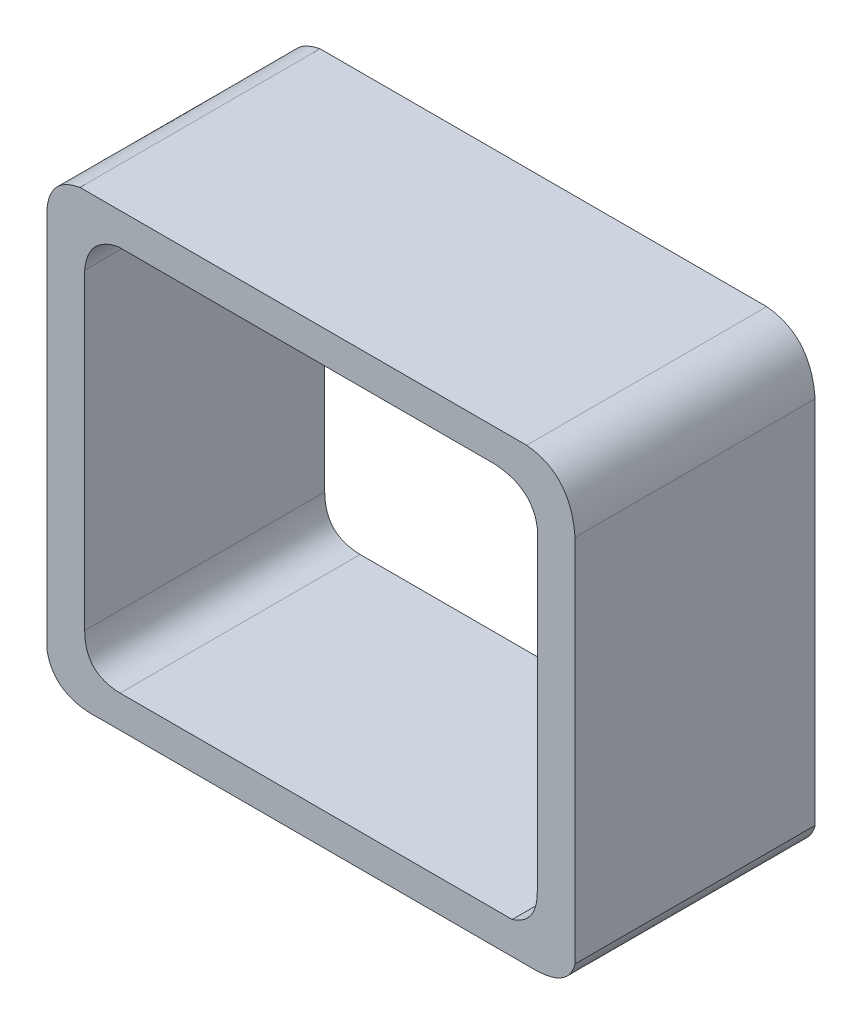
ISO-10303-21;
HEADER;
FILE_DESCRIPTION(('STEP AP214'),'2;1');
FILE_NAME('part.step','',(''),(''),'','','');
FILE_SCHEMA(('AUTOMOTIVE_DESIGN { 1 0 10303 214 1 1 1 1 }'));
ENDSEC;
DATA;
#1=APPLICATION_CONTEXT('core data for automotive mechanical design processes');
#2=APPLICATION_PROTOCOL_DEFINITION('international standard','automotive_design',2000,#1);
#3=PRODUCT_CONTEXT('',#1,'mechanical');
#4=PRODUCT('Part','Part','',(#3));
#5=PRODUCT_RELATED_PRODUCT_CATEGORY('part','',(#4));
#6=PRODUCT_DEFINITION_FORMATION('','',#4);
#7=PRODUCT_DEFINITION_CONTEXT('part definition',#1,'design');
#8=PRODUCT_DEFINITION('design','',#6,#7);
#9=PRODUCT_DEFINITION_SHAPE('','',#8);
#10=(LENGTH_UNIT() NAMED_UNIT(*) SI_UNIT(.MILLI.,.METRE.));
#11=(NAMED_UNIT(*) PLANE_ANGLE_UNIT() SI_UNIT($,.RADIAN.));
#12=(NAMED_UNIT(*) SI_UNIT($,.STERADIAN.) SOLID_ANGLE_UNIT());
#13=UNCERTAINTY_MEASURE_WITH_UNIT(LENGTH_MEASURE(1.E-05),#10,'distance_accuracy_value','');
#14=(GEOMETRIC_REPRESENTATION_CONTEXT(3) GLOBAL_UNCERTAINTY_ASSIGNED_CONTEXT((#13)) GLOBAL_UNIT_ASSIGNED_CONTEXT((#10,
#11,#12)) REPRESENTATION_CONTEXT('',''));
#15=CARTESIAN_POINT('',(0.,0.,0.));
#16=DIRECTION('',(0.,0.,1.));
#17=DIRECTION('',(1.,0.,0.));
#18=AXIS2_PLACEMENT_3D('',#15,#16,#17);
#19=CARTESIAN_POINT('',(16.6593102697515,13.9304612155311,16.));
#20=DIRECTION('',(0.,0.,1.));
#21=DIRECTION('',(1.,0.,0.));
#22=AXIS2_PLACEMENT_3D('',#19,#20,#21);
#23=PLANE('',#22);
#24=CARTESIAN_POINT('',(17.6042980663156,11.30338400737,16.));
#25=CARTESIAN_POINT('',(17.4217243030286,13.5739482873747,16.));
#26=CARTESIAN_POINT('',(16.3443143375626,14.8061536182515,16.));
#27=CARTESIAN_POINT('',(14.3720681699228,15.,16.));
#28=B_SPLINE_CURVE_WITH_KNOTS('',3,(#24,#25,#26,#27),.UNSPECIFIED.,.F.,.F.,(4,4),
(0.157316623204731,1.),.UNSPECIFIED.);
#29=CARTESIAN_POINT('',(17.6042980663156,11.30338400737,16.));
#30=VERTEX_POINT('',#29);
#31=CARTESIAN_POINT('',(14.3720681699228,15.,16.));
#32=VERTEX_POINT('',#31);
#33=EDGE_CURVE('E262',#30,#32,#28,.T.);
#34=ORIENTED_EDGE('',*,*,#33,.T.);
#35=DIRECTION('',(-1.,0.,0.));
#36=VECTOR('',#35,1.);
#37=CARTESIAN_POINT('',(-15.3949592837298,15.,16.));
#38=LINE('',#37,#36);
#39=CARTESIAN_POINT('',(-15.3949592837298,15.,16.));
#40=VERTEX_POINT('',#39);
#41=EDGE_CURVE('E322',#32,#40,#38,.T.);
#42=ORIENTED_EDGE('',*,*,#41,.T.);
#43=CARTESIAN_POINT('',(-15.3949592837298,15.,16.));
#44=CARTESIAN_POINT('',(-17.5420657981008,14.6102082271109,16.));
#45=CARTESIAN_POINT('',(-17.6042980663156,12.4074879216213,16.));
#46=B_SPLINE_CURVE_WITH_KNOTS('',2,(#43,#44,#45),.UNSPECIFIED.,.F.,.F.,(3,3),(0.,1.),.UNSPECIFIED.);
#47=CARTESIAN_POINT('',(-17.6042980663156,12.4074879216213,16.));
#48=VERTEX_POINT('',#47);
#49=EDGE_CURVE('E286',#40,#48,#46,.T.);
#50=ORIENTED_EDGE('',*,*,#49,.T.);
#51=DIRECTION('',(0.,-1.,0.));
#52=VECTOR('',#51,1.);
#53=CARTESIAN_POINT('',(-17.6042980663156,12.4074879216213,16.));
#54=LINE('',#53,#52);
#55=CARTESIAN_POINT('',(-17.6042980663156,-12.7760638343233,16.));
#56=VERTEX_POINT('',#55);
#57=EDGE_CURVE('E303',#48,#56,#54,.T.);
#58=ORIENTED_EDGE('',*,*,#57,.T.);
#59=CARTESIAN_POINT('',(-17.6042980663156,-12.7760638343233,16.));
#60=CARTESIAN_POINT('',(-17.2902562911604,-14.3902822267886,16.));
#61=CARTESIAN_POINT('',(-16.0853475526222,-15.1315942820107,16.));
#62=CARTESIAN_POINT('',(-13.9895718532953,-15.,16.));
#63=B_SPLINE_CURVE_WITH_KNOTS('',3,(#59,#60,#61,#62),.UNSPECIFIED.,.F.,.F.,(4,4),
(0.260635320462798,1.),.UNSPECIFIED.);
#64=CARTESIAN_POINT('',(-13.9895718532953,-15.,16.));
#65=VERTEX_POINT('',#64);
#66=EDGE_CURVE('E301',#56,#65,#63,.T.);
#67=ORIENTED_EDGE('',*,*,#66,.T.);
#68=DIRECTION('',(1.,0.,0.));
#69=VECTOR('',#68,1.);
#70=CARTESIAN_POINT('',(-13.9895718532953,-15.,16.));
#71=LINE('',#70,#69);
#72=CARTESIAN_POINT('',(15.0827152062505,-15.,16.));
#73=VERTEX_POINT('',#72);
#74=EDGE_CURVE('E219',#65,#73,#71,.T.);
#75=ORIENTED_EDGE('',*,*,#74,.T.);
#76=CARTESIAN_POINT('',(15.0827152062505,-15.,16.));
#77=CARTESIAN_POINT('',(16.4965680160882,-14.9362166063096,16.));
#78=CARTESIAN_POINT('',(17.3370956361099,-14.3775771990828,16.));
#79=CARTESIAN_POINT('',(17.6042980663156,-13.3240817783187,16.));
#80=B_SPLINE_CURVE_WITH_KNOTS('',3,(#76,#77,#78,#79),.UNSPECIFIED.,.F.,.F.,(4,4),
(0.317898453115513,1.),.UNSPECIFIED.);
#81=CARTESIAN_POINT('',(17.6042980663156,-13.3240817783187,16.));
#82=VERTEX_POINT('',#81);
#83=EDGE_CURVE('E212',#73,#82,#80,.T.);
#84=ORIENTED_EDGE('',*,*,#83,.T.);
#85=DIRECTION('',(0.,1.,0.));
#86=VECTOR('',#85,1.);
#87=CARTESIAN_POINT('',(17.6042980663156,11.30338400737,16.));
#88=LINE('',#87,#86);
#89=EDGE_CURVE('E218',#82,#30,#88,.T.);
#90=ORIENTED_EDGE('',*,*,#89,.T.);
#91=EDGE_LOOP('',(#34,#42,#50,#58,#67,#75,#84,#90));
#92=FACE_BOUND('',#91,.T.);
#93=DIRECTION('',(-1.,0.,0.));
#94=VECTOR('',#93,1.);
#95=CARTESIAN_POINT('',(-12.8689212726078,12.8514483929723,16.));
#96=LINE('',#95,#94);
#97=CARTESIAN_POINT('',(12.2903539527416,12.8514483929723,16.));
#98=VERTEX_POINT('',#97);
#99=CARTESIAN_POINT('',(-12.8689212726078,12.8514483929723,16.));
#100=VERTEX_POINT('',#99);
#101=EDGE_CURVE('E154',#98,#100,#96,.T.);
#102=ORIENTED_EDGE('',*,*,#101,.F.);
#103=CARTESIAN_POINT('',(15.082715212425,10.6131478156813,16.));
#104=CARTESIAN_POINT('',(14.8684502886742,11.9704653725608,16.));
#105=CARTESIAN_POINT('',(13.9376632021136,12.7165655649873,16.));
#106=CARTESIAN_POINT('',(12.2903539527416,12.8514483929723,16.));
#107=B_SPLINE_CURVE_WITH_KNOTS('',3,(#103,#104,#105,#106),.UNSPECIFIED.,.F.,.F.,(4,4),(0.,
0.76980243189382),.UNSPECIFIED.);
#108=CARTESIAN_POINT('',(15.082715212425,10.6131478156813,16.));
#109=VERTEX_POINT('',#108);
#110=EDGE_CURVE('E146',#109,#98,#107,.T.);
#111=ORIENTED_EDGE('',*,*,#110,.F.);
#112=DIRECTION('',(0.,1.,0.));
#113=VECTOR('',#112,1.);
#114=CARTESIAN_POINT('',(15.082715212425,10.6131478156813,16.));
#115=LINE('',#114,#113);
#116=CARTESIAN_POINT('',(15.082715212425,-10.4227582889799,16.));
#117=VERTEX_POINT('',#116);
#118=EDGE_CURVE('E345',#117,#109,#115,.T.);
#119=ORIENTED_EDGE('',*,*,#118,.F.);
#120=CARTESIAN_POINT('',(13.4154939988609,-12.8514483929723,16.));
#121=CARTESIAN_POINT('',(15.0812475900763,-12.3166377256463,16.));
#122=CARTESIAN_POINT('',(15.082715212425,-10.4227582889799,16.));
#123=B_SPLINE_CURVE_WITH_KNOTS('',2,(#120,#121,#122),.UNSPECIFIED.,.F.,.F.,(3,3),(0.,1.),.UNSPECIFIED.);
#124=CARTESIAN_POINT('',(13.4154939988609,-12.8514483929723,16.));
#125=VERTEX_POINT('',#124);
#126=EDGE_CURVE('E386',#125,#117,#123,.T.);
#127=ORIENTED_EDGE('',*,*,#126,.F.);
#128=DIRECTION('',(1.,0.,0.));
#129=VECTOR('',#128,1.);
#130=CARTESIAN_POINT('',(-12.7203453220306,-12.8514483929723,16.));
#131=LINE('',#130,#129);
#132=CARTESIAN_POINT('',(-12.7203453220306,-12.8514483929723,16.));
#133=VERTEX_POINT('',#132);
#134=EDGE_CURVE('E391',#133,#125,#131,.T.);
#135=ORIENTED_EDGE('',*,*,#134,.F.);
#136=CARTESIAN_POINT('',(-15.0827152062505,-10.4227582889799,16.));
#137=CARTESIAN_POINT('',(-15.0791376066579,-12.7991860372943,16.));
#138=CARTESIAN_POINT('',(-12.7203453220306,-12.8514483929723,16.));
#139=B_SPLINE_CURVE_WITH_KNOTS('',2,(#136,#137,#138),.UNSPECIFIED.,.F.,.F.,(3,3),(0.,1.),.UNSPECIFIED.);
#140=CARTESIAN_POINT('',(-15.0827152062505,-10.4227582889799,16.));
#141=VERTEX_POINT('',#140);
#142=EDGE_CURVE('E408',#141,#133,#139,.T.);
#143=ORIENTED_EDGE('',*,*,#142,.F.);
#144=DIRECTION('',(0.,-1.,0.));
#145=VECTOR('',#144,1.);
#146=CARTESIAN_POINT('',(-15.0827152062505,10.3750395219518,16.));
#147=LINE('',#146,#145);
#148=CARTESIAN_POINT('',(-15.0827152062505,10.3750395219518,16.));
#149=VERTEX_POINT('',#148);
#150=EDGE_CURVE('E169',#149,#141,#147,.T.);
#151=ORIENTED_EDGE('',*,*,#150,.F.);
#152=CARTESIAN_POINT('',(-12.8689212726078,12.8514483929723,16.));
#153=CARTESIAN_POINT('',(-14.9019133618119,12.4221796013516,16.));
#154=CARTESIAN_POINT('',(-15.0827152062505,10.3750395219518,16.));
#155=B_SPLINE_CURVE_WITH_KNOTS('',2,(#152,#153,#154),.UNSPECIFIED.,.F.,.F.,(3,3),(0.,1.),.UNSPECIFIED.);
#156=EDGE_CURVE('E167',#100,#149,#155,.T.);
#157=ORIENTED_EDGE('',*,*,#156,.F.);
#158=EDGE_LOOP('',(#102,#111,#119,#127,#135,#143,#151,#157));
#159=FACE_BOUND('',#158,.T.);
#160=ADVANCED_FACE('F32',(#92,#159),#23,.T.);
#161=CARTESIAN_POINT('',(16.6593102697515,13.9304612155311,0.));
#162=DIRECTION('',(0.,0.,1.));
#163=DIRECTION('',(1.,0.,0.));
#164=AXIS2_PLACEMENT_3D('',#161,#162,#163);
#165=PLANE('',#164);
#166=CARTESIAN_POINT('',(17.6042980663156,11.30338400737,0.));
#167=CARTESIAN_POINT('',(17.4217243030286,13.5739482873747,0.));
#168=CARTESIAN_POINT('',(16.3443143375626,14.8061536182515,0.));
#169=CARTESIAN_POINT('',(14.3720681699228,15.,0.));
#170=B_SPLINE_CURVE_WITH_KNOTS('',3,(#166,#167,#168,#169),.UNSPECIFIED.,.F.,.F.,(4,4),
(0.157316623204731,1.),.UNSPECIFIED.);
#171=CARTESIAN_POINT('',(17.6042980663156,11.30338400737,0.));
#172=VERTEX_POINT('',#171);
#173=CARTESIAN_POINT('',(14.3720681699228,15.,0.));
#174=VERTEX_POINT('',#173);
#175=EDGE_CURVE('E162',#172,#174,#170,.T.);
#176=ORIENTED_EDGE('',*,*,#175,.F.);
#177=DIRECTION('',(0.,1.,0.));
#178=VECTOR('',#177,1.);
#179=CARTESIAN_POINT('',(17.6042980663156,11.30338400737,0.));
#180=LINE('',#179,#178);
#181=CARTESIAN_POINT('',(17.6042980663156,-13.3240817783187,0.));
#182=VERTEX_POINT('',#181);
#183=EDGE_CURVE('E257',#182,#172,#180,.T.);
#184=ORIENTED_EDGE('',*,*,#183,.F.);
#185=CARTESIAN_POINT('',(15.0827152062505,-15.,0.));
#186=CARTESIAN_POINT('',(16.4965680160882,-14.9362166063096,0.));
#187=CARTESIAN_POINT('',(17.3370956361099,-14.3775771990828,0.));
#188=CARTESIAN_POINT('',(17.6042980663156,-13.3240817783187,0.));
#189=B_SPLINE_CURVE_WITH_KNOTS('',3,(#185,#186,#187,#188),.UNSPECIFIED.,.F.,.F.,(4,4),
(0.317898453115513,1.),.UNSPECIFIED.);
#190=CARTESIAN_POINT('',(15.0827152062505,-15.,0.));
#191=VERTEX_POINT('',#190);
#192=EDGE_CURVE('E253',#191,#182,#189,.T.);
#193=ORIENTED_EDGE('',*,*,#192,.F.);
#194=DIRECTION('',(1.,0.,0.));
#195=VECTOR('',#194,1.);
#196=CARTESIAN_POINT('',(-13.9895718532953,-15.,0.));
#197=LINE('',#196,#195);
#198=CARTESIAN_POINT('',(-13.9895718532953,-15.,0.));
#199=VERTEX_POINT('',#198);
#200=EDGE_CURVE('E248',#199,#191,#197,.T.);
#201=ORIENTED_EDGE('',*,*,#200,.F.);
#202=CARTESIAN_POINT('',(-17.6042980663156,-12.7760638343233,0.));
#203=CARTESIAN_POINT('',(-17.2902562911604,-14.3902822267886,0.));
#204=CARTESIAN_POINT('',(-16.0853475526222,-15.1315942820107,0.));
#205=CARTESIAN_POINT('',(-13.9895718532953,-15.,0.));
#206=B_SPLINE_CURVE_WITH_KNOTS('',3,(#202,#203,#204,#205),.UNSPECIFIED.,.F.,.F.,(4,4),
(0.260635320462798,1.),.UNSPECIFIED.);
#207=CARTESIAN_POINT('',(-17.6042980663156,-12.7760638343233,0.));
#208=VERTEX_POINT('',#207);
#209=EDGE_CURVE('E244',#208,#199,#206,.T.);
#210=ORIENTED_EDGE('',*,*,#209,.F.);
#211=DIRECTION('',(0.,-1.,0.));
#212=VECTOR('',#211,1.);
#213=CARTESIAN_POINT('',(-17.6042980663156,12.4074879216213,0.));
#214=LINE('',#213,#212);
#215=CARTESIAN_POINT('',(-17.6042980663156,12.4074879216213,0.));
#216=VERTEX_POINT('',#215);
#217=EDGE_CURVE('E239',#216,#208,#214,.T.);
#218=ORIENTED_EDGE('',*,*,#217,.F.);
#219=CARTESIAN_POINT('',(-15.3949592837298,15.,0.));
#220=CARTESIAN_POINT('',(-17.5420657981008,14.6102082271109,0.));
#221=CARTESIAN_POINT('',(-17.6042980663156,12.4074879216213,0.));
#222=B_SPLINE_CURVE_WITH_KNOTS('',2,(#219,#220,#221),.UNSPECIFIED.,.F.,.F.,(3,3),(0.,1.),.UNSPECIFIED.);
#223=CARTESIAN_POINT('',(-15.3949592837298,15.,0.));
#224=VERTEX_POINT('',#223);
#225=EDGE_CURVE('E235',#224,#216,#222,.T.);
#226=ORIENTED_EDGE('',*,*,#225,.F.);
#227=DIRECTION('',(-1.,0.,0.));
#228=VECTOR('',#227,1.);
#229=CARTESIAN_POINT('',(-15.3949592837298,15.,0.));
#230=LINE('',#229,#228);
#231=EDGE_CURVE('E230',#174,#224,#230,.T.);
#232=ORIENTED_EDGE('',*,*,#231,.F.);
#233=EDGE_LOOP('',(#176,#184,#193,#201,#210,#218,#226,#232));
#234=FACE_BOUND('',#233,.T.);
#235=CARTESIAN_POINT('',(15.082715212425,10.6131478156813,0.));
#236=CARTESIAN_POINT('',(14.8684502886742,11.9704653725608,0.));
#237=CARTESIAN_POINT('',(13.9376632021136,12.7165655649873,0.));
#238=CARTESIAN_POINT('',(12.2903539527416,12.8514483929723,0.));
#239=B_SPLINE_CURVE_WITH_KNOTS('',3,(#235,#236,#237,#238),.UNSPECIFIED.,.F.,.F.,(4,4),(0.,
0.76980243189382),.UNSPECIFIED.);
#240=CARTESIAN_POINT('',(15.082715212425,10.6131478156813,0.));
#241=VERTEX_POINT('',#240);
#242=CARTESIAN_POINT('',(12.2903539527416,12.8514483929723,0.));
#243=VERTEX_POINT('',#242);
#244=EDGE_CURVE('E56',#241,#243,#239,.T.);
#245=ORIENTED_EDGE('',*,*,#244,.T.);
#246=DIRECTION('',(-1.,0.,0.));
#247=VECTOR('',#246,1.);
#248=CARTESIAN_POINT('',(-12.8689212726078,12.8514483929723,0.));
#249=LINE('',#248,#247);
#250=CARTESIAN_POINT('',(-12.8689212726078,12.8514483929723,0.));
#251=VERTEX_POINT('',#250);
#252=EDGE_CURVE('E161',#243,#251,#249,.T.);
#253=ORIENTED_EDGE('',*,*,#252,.T.);
#254=CARTESIAN_POINT('',(-12.8689212726078,12.8514483929723,0.));
#255=CARTESIAN_POINT('',(-14.9019133618119,12.4221796013516,0.));
#256=CARTESIAN_POINT('',(-15.0827152062505,10.3750395219518,0.));
#257=B_SPLINE_CURVE_WITH_KNOTS('',2,(#254,#255,#256),.UNSPECIFIED.,.F.,.F.,(3,3),(0.,1.),.UNSPECIFIED.);
#258=CARTESIAN_POINT('',(-15.0827152062505,10.3750395219518,0.));
#259=VERTEX_POINT('',#258);
#260=EDGE_CURVE('E370',#251,#259,#257,.T.);
#261=ORIENTED_EDGE('',*,*,#260,.T.);
#262=DIRECTION('',(0.,-1.,0.));
#263=VECTOR('',#262,1.);
#264=CARTESIAN_POINT('',(-15.0827152062505,10.3750395219518,0.));
#265=LINE('',#264,#263);
#266=CARTESIAN_POINT('',(-15.0827152062505,-10.4227582889799,0.));
#267=VERTEX_POINT('',#266);
#268=EDGE_CURVE('E364',#259,#267,#265,.T.);
#269=ORIENTED_EDGE('',*,*,#268,.T.);
#270=CARTESIAN_POINT('',(-15.0827152062505,-10.4227582889799,0.));
#271=CARTESIAN_POINT('',(-15.0791376066579,-12.7991860372943,0.));
#272=CARTESIAN_POINT('',(-12.7203453220306,-12.8514483929723,0.));
#273=B_SPLINE_CURVE_WITH_KNOTS('',2,(#270,#271,#272),.UNSPECIFIED.,.F.,.F.,(3,3),(0.,1.),.UNSPECIFIED.);
#274=CARTESIAN_POINT('',(-12.7203453220306,-12.8514483929723,0.));
#275=VERTEX_POINT('',#274);
#276=EDGE_CURVE('E359',#267,#275,#273,.T.);
#277=ORIENTED_EDGE('',*,*,#276,.T.);
#278=DIRECTION('',(1.,0.,0.));
#279=VECTOR('',#278,1.);
#280=CARTESIAN_POINT('',(-12.7203453220306,-12.8514483929723,0.));
#281=LINE('',#280,#279);
#282=CARTESIAN_POINT('',(13.4154939988609,-12.8514483929723,0.));
#283=VERTEX_POINT('',#282);
#284=EDGE_CURVE('E353',#275,#283,#281,.T.);
#285=ORIENTED_EDGE('',*,*,#284,.T.);
#286=CARTESIAN_POINT('',(13.4154939988609,-12.8514483929723,0.));
#287=CARTESIAN_POINT('',(15.0812475900763,-12.3166377256463,0.));
#288=CARTESIAN_POINT('',(15.082715212425,-10.4227582889799,0.));
#289=B_SPLINE_CURVE_WITH_KNOTS('',2,(#286,#287,#288),.UNSPECIFIED.,.F.,.F.,(3,3),(0.,1.),.UNSPECIFIED.);
#290=CARTESIAN_POINT('',(15.082715212425,-10.4227582889799,0.));
#291=VERTEX_POINT('',#290);
#292=EDGE_CURVE('E348',#283,#291,#289,.T.);
#293=ORIENTED_EDGE('',*,*,#292,.T.);
#294=DIRECTION('',(0.,1.,0.));
#295=VECTOR('',#294,1.);
#296=CARTESIAN_POINT('',(15.082715212425,10.6131478156813,0.));
#297=LINE('',#296,#295);
#298=EDGE_CURVE('E155',#291,#241,#297,.T.);
#299=ORIENTED_EDGE('',*,*,#298,.T.);
#300=EDGE_LOOP('',(#245,#253,#261,#269,#277,#285,#293,#299));
#301=FACE_BOUND('',#300,.T.);
#302=ADVANCED_FACE('F197',(#234,#301),#165,.F.);
#303=DIRECTION('',(0.,0.,-1.));
#304=VECTOR('',#303,1.);
#305=SURFACE_OF_LINEAR_EXTRUSION('',#28,#304);
#306=ORIENTED_EDGE('',*,*,#175,.T.);
#307=DIRECTION('',(0.,0.,-1.));
#308=VECTOR('',#307,1.);
#309=CARTESIAN_POINT('',(14.3720681699228,15.,16.));
#310=LINE('',#309,#308);
#311=EDGE_CURVE('E11',#32,#174,#310,.T.);
#312=ORIENTED_EDGE('',*,*,#311,.F.);
#313=ORIENTED_EDGE('',*,*,#33,.F.);
#314=DIRECTION('',(0.,0.,-1.));
#315=VECTOR('',#314,1.);
#316=CARTESIAN_POINT('',(17.6042980663156,11.30338400737,16.));
#317=LINE('',#316,#315);
#318=EDGE_CURVE('E225',#30,#172,#317,.T.);
#319=ORIENTED_EDGE('',*,*,#318,.T.);
#320=EDGE_LOOP('',(#306,#312,#313,#319));
#321=FACE_BOUND('',#320,.T.);
#322=ADVANCED_FACE('F34',(#321),#305,.F.);
#323=CARTESIAN_POINT('',(-15.3949592837298,15.,16.));
#324=DIRECTION('',(0.,-1.,0.));
#325=DIRECTION('',(1.,0.,0.));
#326=AXIS2_PLACEMENT_3D('',#323,#324,#325);
#327=PLANE('',#326);
#328=ORIENTED_EDGE('',*,*,#231,.T.);
#329=DIRECTION('',(0.,0.,-1.));
#330=VECTOR('',#329,1.);
#331=CARTESIAN_POINT('',(-15.3949592837298,15.,16.));
#332=LINE('',#331,#330);
#333=EDGE_CURVE('E41',#40,#224,#332,.T.);
#334=ORIENTED_EDGE('',*,*,#333,.F.);
#335=ORIENTED_EDGE('',*,*,#41,.F.);
#336=ORIENTED_EDGE('',*,*,#311,.T.);
#337=EDGE_LOOP('',(#328,#334,#335,#336));
#338=FACE_BOUND('',#337,.T.);
#339=ADVANCED_FACE('F317',(#338),#327,.F.);
#340=DIRECTION('',(0.,0.,-1.));
#341=VECTOR('',#340,1.);
#342=SURFACE_OF_LINEAR_EXTRUSION('',#46,#341);
#343=ORIENTED_EDGE('',*,*,#225,.T.);
#344=DIRECTION('',(0.,0.,-1.));
#345=VECTOR('',#344,1.);
#346=CARTESIAN_POINT('',(-17.6042980663156,12.4074879216213,16.));
#347=LINE('',#346,#345);
#348=EDGE_CURVE('E277',#48,#216,#347,.T.);
#349=ORIENTED_EDGE('',*,*,#348,.F.);
#350=ORIENTED_EDGE('',*,*,#49,.F.);
#351=ORIENTED_EDGE('',*,*,#333,.T.);
#352=EDGE_LOOP('',(#343,#349,#350,#351));
#353=FACE_BOUND('',#352,.T.);
#354=ADVANCED_FACE('F284',(#353),#342,.F.);
#355=CARTESIAN_POINT('',(-17.6042980663156,12.4074879216213,16.));
#356=DIRECTION('',(1.,0.,0.));
#357=DIRECTION('',(0.,1.,0.));
#358=AXIS2_PLACEMENT_3D('',#355,#356,#357);
#359=PLANE('',#358);
#360=ORIENTED_EDGE('',*,*,#217,.T.);
#361=DIRECTION('',(0.,0.,-1.));
#362=VECTOR('',#361,1.);
#363=CARTESIAN_POINT('',(-17.6042980663156,-12.7760638343233,16.));
#364=LINE('',#363,#362);
#365=EDGE_CURVE('E274',#56,#208,#364,.T.);
#366=ORIENTED_EDGE('',*,*,#365,.F.);
#367=ORIENTED_EDGE('',*,*,#57,.F.);
#368=ORIENTED_EDGE('',*,*,#348,.T.);
#369=EDGE_LOOP('',(#360,#366,#367,#368));
#370=FACE_BOUND('',#369,.T.);
#371=ADVANCED_FACE('F295',(#370),#359,.F.);
#372=DIRECTION('',(0.,0.,-1.));
#373=VECTOR('',#372,1.);
#374=SURFACE_OF_LINEAR_EXTRUSION('',#63,#373);
#375=ORIENTED_EDGE('',*,*,#209,.T.);
#376=DIRECTION('',(0.,0.,-1.));
#377=VECTOR('',#376,1.);
#378=CARTESIAN_POINT('',(-13.9895718532953,-15.,16.));
#379=LINE('',#378,#377);
#380=EDGE_CURVE('E271',#65,#199,#379,.T.);
#381=ORIENTED_EDGE('',*,*,#380,.F.);
#382=ORIENTED_EDGE('',*,*,#66,.F.);
#383=ORIENTED_EDGE('',*,*,#365,.T.);
#384=EDGE_LOOP('',(#375,#381,#382,#383));
#385=FACE_BOUND('',#384,.T.);
#386=ADVANCED_FACE('F299',(#385),#374,.F.);
#387=CARTESIAN_POINT('',(-13.9895718532953,-15.,16.));
#388=DIRECTION('',(0.,1.,0.));
#389=DIRECTION('',(0.,0.,1.));
#390=AXIS2_PLACEMENT_3D('',#387,#388,#389);
#391=PLANE('',#390);
#392=ORIENTED_EDGE('',*,*,#200,.T.);
#393=DIRECTION('',(0.,0.,-1.));
#394=VECTOR('',#393,1.);
#395=CARTESIAN_POINT('',(15.0827152062505,-15.,16.));
#396=LINE('',#395,#394);
#397=EDGE_CURVE('E268',#73,#191,#396,.T.);
#398=ORIENTED_EDGE('',*,*,#397,.F.);
#399=ORIENTED_EDGE('',*,*,#74,.F.);
#400=ORIENTED_EDGE('',*,*,#380,.T.);
#401=EDGE_LOOP('',(#392,#398,#399,#400));
#402=FACE_BOUND('',#401,.T.);
#403=ADVANCED_FACE('F209',(#402),#391,.F.);
#404=DIRECTION('',(0.,0.,-1.));
#405=VECTOR('',#404,1.);
#406=SURFACE_OF_LINEAR_EXTRUSION('',#80,#405);
#407=ORIENTED_EDGE('',*,*,#192,.T.);
#408=DIRECTION('',(0.,0.,-1.));
#409=VECTOR('',#408,1.);
#410=CARTESIAN_POINT('',(17.6042980663156,-13.3240817783187,16.));
#411=LINE('',#410,#409);
#412=EDGE_CURVE('E265',#82,#182,#411,.T.);
#413=ORIENTED_EDGE('',*,*,#412,.F.);
#414=ORIENTED_EDGE('',*,*,#83,.F.);
#415=ORIENTED_EDGE('',*,*,#397,.T.);
#416=EDGE_LOOP('',(#407,#413,#414,#415));
#417=FACE_BOUND('',#416,.T.);
#418=ADVANCED_FACE('F204',(#417),#406,.F.);
#419=CARTESIAN_POINT('',(17.6042980663156,11.30338400737,16.));
#420=DIRECTION('',(-1.,0.,0.));
#421=DIRECTION('',(0.,-1.,0.));
#422=AXIS2_PLACEMENT_3D('',#419,#420,#421);
#423=PLANE('',#422);
#424=ORIENTED_EDGE('',*,*,#183,.T.);
#425=ORIENTED_EDGE('',*,*,#318,.F.);
#426=ORIENTED_EDGE('',*,*,#89,.F.);
#427=ORIENTED_EDGE('',*,*,#412,.T.);
#428=EDGE_LOOP('',(#424,#425,#426,#427));
#429=FACE_BOUND('',#428,.T.);
#430=ADVANCED_FACE('F194',(#429),#423,.F.);
#431=DIRECTION('',(0.,0.,-1.));
#432=VECTOR('',#431,1.);
#433=SURFACE_OF_LINEAR_EXTRUSION('',#107,#432);
#434=ORIENTED_EDGE('',*,*,#244,.F.);
#435=DIRECTION('',(0.,0.,-1.));
#436=VECTOR('',#435,1.);
#437=CARTESIAN_POINT('',(15.082715212425,10.6131478156813,16.));
#438=LINE('',#437,#436);
#439=EDGE_CURVE('E150',#109,#241,#438,.T.);
#440=ORIENTED_EDGE('',*,*,#439,.F.);
#441=ORIENTED_EDGE('',*,*,#110,.T.);
#442=DIRECTION('',(0.,0.,-1.));
#443=VECTOR('',#442,1.);
#444=CARTESIAN_POINT('',(12.2903539527416,12.8514483929723,16.));
#445=LINE('',#444,#443);
#446=EDGE_CURVE('E149',#98,#243,#445,.T.);
#447=ORIENTED_EDGE('',*,*,#446,.T.);
#448=EDGE_LOOP('',(#434,#440,#441,#447));
#449=FACE_BOUND('',#448,.T.);
#450=ADVANCED_FACE('F148',(#449),#433,.T.);
#451=CARTESIAN_POINT('',(-12.8689212726078,12.8514483929723,16.));
#452=DIRECTION('',(0.,-1.,0.));
#453=DIRECTION('',(0.,0.,-1.));
#454=AXIS2_PLACEMENT_3D('',#451,#452,#453);
#455=PLANE('',#454);
#456=ORIENTED_EDGE('',*,*,#252,.F.);
#457=ORIENTED_EDGE('',*,*,#446,.F.);
#458=ORIENTED_EDGE('',*,*,#101,.T.);
#459=DIRECTION('',(0.,0.,-1.));
#460=VECTOR('',#459,1.);
#461=CARTESIAN_POINT('',(-12.8689212726078,12.8514483929723,16.));
#462=LINE('',#461,#460);
#463=EDGE_CURVE('E163',#100,#251,#462,.T.);
#464=ORIENTED_EDGE('',*,*,#463,.T.);
#465=EDGE_LOOP('',(#456,#457,#458,#464));
#466=FACE_BOUND('',#465,.T.);
#467=ADVANCED_FACE('F158',(#466),#455,.T.);
#468=DIRECTION('',(0.,0.,-1.));
#469=VECTOR('',#468,1.);
#470=SURFACE_OF_LINEAR_EXTRUSION('',#155,#469);
#471=ORIENTED_EDGE('',*,*,#260,.F.);
#472=ORIENTED_EDGE('',*,*,#463,.F.);
#473=ORIENTED_EDGE('',*,*,#156,.T.);
#474=DIRECTION('',(0.,0.,-1.));
#475=VECTOR('',#474,1.);
#476=CARTESIAN_POINT('',(-15.0827152062505,10.3750395219518,16.));
#477=LINE('',#476,#475);
#478=EDGE_CURVE('E335',#149,#259,#477,.T.);
#479=ORIENTED_EDGE('',*,*,#478,.T.);
#480=EDGE_LOOP('',(#471,#472,#473,#479));
#481=FACE_BOUND('',#480,.T.);
#482=ADVANCED_FACE('F183',(#481),#470,.T.);
#483=CARTESIAN_POINT('',(-15.0827152062505,10.3750395219518,16.));
#484=DIRECTION('',(1.,0.,0.));
#485=DIRECTION('',(0.,0.,-1.));
#486=AXIS2_PLACEMENT_3D('',#483,#484,#485);
#487=PLANE('',#486);
#488=ORIENTED_EDGE('',*,*,#268,.F.);
#489=ORIENTED_EDGE('',*,*,#478,.F.);
#490=ORIENTED_EDGE('',*,*,#150,.T.);
#491=DIRECTION('',(0.,0.,-1.));
#492=VECTOR('',#491,1.);
#493=CARTESIAN_POINT('',(-15.0827152062505,-10.4227582889799,16.));
#494=LINE('',#493,#492);
#495=EDGE_CURVE('E337',#141,#267,#494,.T.);
#496=ORIENTED_EDGE('',*,*,#495,.T.);
#497=EDGE_LOOP('',(#488,#489,#490,#496));
#498=FACE_BOUND('',#497,.T.);
#499=ADVANCED_FACE('F187',(#498),#487,.T.);
#500=DIRECTION('',(0.,0.,-1.));
#501=VECTOR('',#500,1.);
#502=SURFACE_OF_LINEAR_EXTRUSION('',#139,#501);
#503=ORIENTED_EDGE('',*,*,#276,.F.);
#504=ORIENTED_EDGE('',*,*,#495,.F.);
#505=ORIENTED_EDGE('',*,*,#142,.T.);
#506=DIRECTION('',(0.,0.,-1.));
#507=VECTOR('',#506,1.);
#508=CARTESIAN_POINT('',(-12.7203453220306,-12.8514483929723,16.));
#509=LINE('',#508,#507);
#510=EDGE_CURVE('E339',#133,#275,#509,.T.);
#511=ORIENTED_EDGE('',*,*,#510,.T.);
#512=EDGE_LOOP('',(#503,#504,#505,#511));
#513=FACE_BOUND('',#512,.T.);
#514=ADVANCED_FACE('F404',(#513),#502,.T.);
#515=CARTESIAN_POINT('',(-12.7203453220306,-12.8514483929723,16.));
#516=DIRECTION('',(0.,1.,0.));
#517=DIRECTION('',(0.,0.,1.));
#518=AXIS2_PLACEMENT_3D('',#515,#516,#517);
#519=PLANE('',#518);
#520=ORIENTED_EDGE('',*,*,#284,.F.);
#521=ORIENTED_EDGE('',*,*,#510,.F.);
#522=ORIENTED_EDGE('',*,*,#134,.T.);
#523=DIRECTION('',(0.,0.,-1.));
#524=VECTOR('',#523,1.);
#525=CARTESIAN_POINT('',(13.4154939988609,-12.8514483929723,16.));
#526=LINE('',#525,#524);
#527=EDGE_CURVE('E341',#125,#283,#526,.T.);
#528=ORIENTED_EDGE('',*,*,#527,.T.);
#529=EDGE_LOOP('',(#520,#521,#522,#528));
#530=FACE_BOUND('',#529,.T.);
#531=ADVANCED_FACE('F401',(#530),#519,.T.);
#532=DIRECTION('',(0.,0.,-1.));
#533=VECTOR('',#532,1.);
#534=SURFACE_OF_LINEAR_EXTRUSION('',#123,#533);
#535=ORIENTED_EDGE('',*,*,#292,.F.);
#536=ORIENTED_EDGE('',*,*,#527,.F.);
#537=ORIENTED_EDGE('',*,*,#126,.T.);
#538=DIRECTION('',(0.,0.,-1.));
#539=VECTOR('',#538,1.);
#540=CARTESIAN_POINT('',(15.082715212425,-10.4227582889799,16.));
#541=LINE('',#540,#539);
#542=EDGE_CURVE('E48',#117,#291,#541,.T.);
#543=ORIENTED_EDGE('',*,*,#542,.T.);
#544=EDGE_LOOP('',(#535,#536,#537,#543));
#545=FACE_BOUND('',#544,.T.);
#546=ADVANCED_FACE('F396',(#545),#534,.T.);
#547=CARTESIAN_POINT('',(15.082715212425,10.6131478156813,16.));
#548=DIRECTION('',(-1.,0.,0.));
#549=DIRECTION('',(0.,-1.,0.));
#550=AXIS2_PLACEMENT_3D('',#547,#548,#549);
#551=PLANE('',#550);
#552=ORIENTED_EDGE('',*,*,#298,.F.);
#553=ORIENTED_EDGE('',*,*,#542,.F.);
#554=ORIENTED_EDGE('',*,*,#118,.T.);
#555=ORIENTED_EDGE('',*,*,#439,.T.);
#556=EDGE_LOOP('',(#552,#553,#554,#555));
#557=FACE_BOUND('',#556,.T.);
#558=ADVANCED_FACE('F400',(#557),#551,.T.);
#559=CLOSED_SHELL('',(#160,#302,#322,#339,#354,#371,#386,#403,#418,#430,#450,#467,#482,#499,
#514,#531,#546,#558));
#560=MANIFOLD_SOLID_BREP('B2',#559);
#561=ADVANCED_BREP_SHAPE_REPRESENTATION('',(#18,#560),#14);
#562=SHAPE_DEFINITION_REPRESENTATION(#9,#561);
ENDSEC;
END-ISO-10303-21;
